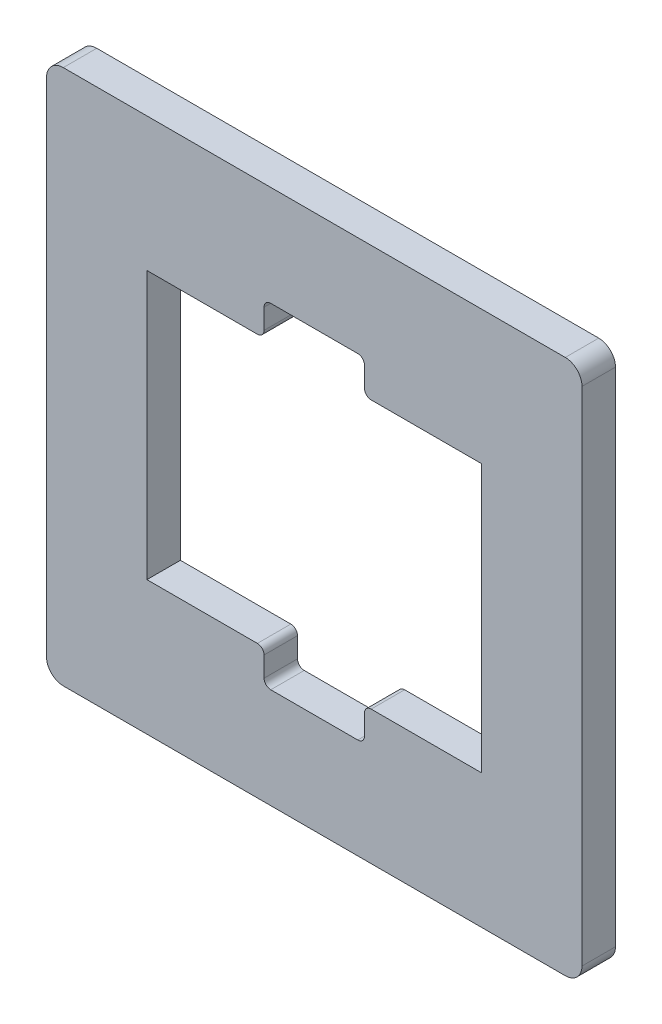
ISO-10303-21;
HEADER;
FILE_DESCRIPTION(('STEP AP214'),'2;1');
FILE_NAME('part.step','',(''),(''),'','','');
FILE_SCHEMA(('AUTOMOTIVE_DESIGN { 1 0 10303 214 1 1 1 1 }'));
ENDSEC;
DATA;
#1=APPLICATION_CONTEXT('core data for automotive mechanical design processes');
#2=APPLICATION_PROTOCOL_DEFINITION('international standard','automotive_design',2000,#1);
#3=PRODUCT_CONTEXT('',#1,'mechanical');
#4=PRODUCT('Part','Part','',(#3));
#5=PRODUCT_RELATED_PRODUCT_CATEGORY('part','',(#4));
#6=PRODUCT_DEFINITION_FORMATION('','',#4);
#7=PRODUCT_DEFINITION_CONTEXT('part definition',#1,'design');
#8=PRODUCT_DEFINITION('design','',#6,#7);
#9=PRODUCT_DEFINITION_SHAPE('','',#8);
#10=(LENGTH_UNIT() NAMED_UNIT(*) SI_UNIT(.MILLI.,.METRE.));
#11=(NAMED_UNIT(*) PLANE_ANGLE_UNIT() SI_UNIT($,.RADIAN.));
#12=(NAMED_UNIT(*) SI_UNIT($,.STERADIAN.) SOLID_ANGLE_UNIT());
#13=UNCERTAINTY_MEASURE_WITH_UNIT(LENGTH_MEASURE(1.E-05),#10,'distance_accuracy_value','');
#14=(GEOMETRIC_REPRESENTATION_CONTEXT(3) GLOBAL_UNCERTAINTY_ASSIGNED_CONTEXT((#13)) GLOBAL_UNIT_ASSIGNED_CONTEXT((#10,
#11,#12)) REPRESENTATION_CONTEXT('',''));
#15=CARTESIAN_POINT('',(0.,0.,0.));
#16=DIRECTION('',(0.,0.,1.));
#17=DIRECTION('',(1.,0.,0.));
#18=AXIS2_PLACEMENT_3D('',#15,#16,#17);
#19=CARTESIAN_POINT('',(0.,0.,-1.));
#20=DIRECTION('',(0.,0.,1.));
#21=DIRECTION('',(1.,0.,0.));
#22=AXIS2_PLACEMENT_3D('',#19,#20,#21);
#23=PLANE('',#22);
#24=DIRECTION('',(1.,0.,0.));
#25=VECTOR('',#24,1.);
#26=CARTESIAN_POINT('',(-8.,-8.,-1.));
#27=LINE('',#26,#25);
#28=CARTESIAN_POINT('',(-7.5,-8.,-1.));
#29=VERTEX_POINT('',#28);
#30=CARTESIAN_POINT('',(7.5,-8.,-1.));
#31=VERTEX_POINT('',#30);
#32=EDGE_CURVE('E284',#29,#31,#27,.T.);
#33=ORIENTED_EDGE('',*,*,#32,.F.);
#34=CARTESIAN_POINT('',(-7.5,-7.5,-1.));
#35=DIRECTION('',(0.,0.,1.));
#36=DIRECTION('',(1.,0.,0.));
#37=AXIS2_PLACEMENT_3D('',#34,#35,#36);
#38=CIRCLE('',#37,0.5);
#39=CARTESIAN_POINT('',(-8.,-7.5,-1.));
#40=VERTEX_POINT('',#39);
#41=EDGE_CURVE('E321',#29,#40,#38,.F.);
#42=ORIENTED_EDGE('',*,*,#41,.T.);
#43=DIRECTION('',(0.,-1.,0.));
#44=VECTOR('',#43,1.);
#45=CARTESIAN_POINT('',(-8.,8.,-1.));
#46=LINE('',#45,#44);
#47=CARTESIAN_POINT('',(-8.,7.5,-1.));
#48=VERTEX_POINT('',#47);
#49=EDGE_CURVE('E281',#48,#40,#46,.T.);
#50=ORIENTED_EDGE('',*,*,#49,.F.);
#51=CARTESIAN_POINT('',(-7.5,7.5,-1.));
#52=DIRECTION('',(0.,0.,1.));
#53=DIRECTION('',(1.,0.,0.));
#54=AXIS2_PLACEMENT_3D('',#51,#52,#53);
#55=CIRCLE('',#54,0.5);
#56=CARTESIAN_POINT('',(-7.5,8.,-1.));
#57=VERTEX_POINT('',#56);
#58=EDGE_CURVE('E315',#48,#57,#55,.F.);
#59=ORIENTED_EDGE('',*,*,#58,.T.);
#60=DIRECTION('',(-1.,0.,0.));
#61=VECTOR('',#60,1.);
#62=CARTESIAN_POINT('',(-8.,8.,-1.));
#63=LINE('',#62,#61);
#64=CARTESIAN_POINT('',(7.5,8.,-1.));
#65=VERTEX_POINT('',#64);
#66=EDGE_CURVE('E277',#65,#57,#63,.T.);
#67=ORIENTED_EDGE('',*,*,#66,.F.);
#68=CARTESIAN_POINT('',(7.5,7.5,-1.));
#69=DIRECTION('',(0.,0.,1.));
#70=DIRECTION('',(1.,0.,0.));
#71=AXIS2_PLACEMENT_3D('',#68,#69,#70);
#72=CIRCLE('',#71,0.5);
#73=CARTESIAN_POINT('',(8.,7.5,-1.));
#74=VERTEX_POINT('',#73);
#75=EDGE_CURVE('E317',#65,#74,#72,.F.);
#76=ORIENTED_EDGE('',*,*,#75,.T.);
#77=DIRECTION('',(0.,1.,0.));
#78=VECTOR('',#77,1.);
#79=CARTESIAN_POINT('',(8.,8.,-1.));
#80=LINE('',#79,#78);
#81=CARTESIAN_POINT('',(8.,-7.5,-1.));
#82=VERTEX_POINT('',#81);
#83=EDGE_CURVE('E274',#82,#74,#80,.T.);
#84=ORIENTED_EDGE('',*,*,#83,.F.);
#85=CARTESIAN_POINT('',(7.5,-7.5,-1.));
#86=DIRECTION('',(0.,0.,1.));
#87=DIRECTION('',(1.,0.,0.));
#88=AXIS2_PLACEMENT_3D('',#85,#86,#87);
#89=CIRCLE('',#88,0.5);
#90=EDGE_CURVE('E319',#82,#31,#89,.F.);
#91=ORIENTED_EDGE('',*,*,#90,.T.);
#92=EDGE_LOOP('',(#33,#42,#50,#59,#67,#76,#84,#91));
#93=FACE_BOUND('',#92,.T.);
#94=DIRECTION('',(0.,-1.,0.));
#95=VECTOR('',#94,1.);
#96=CARTESIAN_POINT('',(1.5,-5.,-1.));
#97=LINE('',#96,#95);
#98=CARTESIAN_POINT('',(1.5,-4.2,-1.));
#99=VERTEX_POINT('',#98);
#100=CARTESIAN_POINT('',(1.5,-4.8,-1.));
#101=VERTEX_POINT('',#100);
#102=EDGE_CURVE('E437',#99,#101,#97,.T.);
#103=ORIENTED_EDGE('',*,*,#102,.F.);
#104=CARTESIAN_POINT('',(1.7,-4.2,-1.));
#105=DIRECTION('',(0.,0.,1.));
#106=DIRECTION('',(1.,0.,0.));
#107=AXIS2_PLACEMENT_3D('',#104,#105,#106);
#108=CIRCLE('',#107,0.2);
#109=CARTESIAN_POINT('',(1.7,-4.,-1.));
#110=VERTEX_POINT('',#109);
#111=EDGE_CURVE('E355',#99,#110,#108,.F.);
#112=ORIENTED_EDGE('',*,*,#111,.T.);
#113=DIRECTION('',(1.,0.,0.));
#114=VECTOR('',#113,1.);
#115=CARTESIAN_POINT('',(-5.,-4.,-1.));
#116=LINE('',#115,#114);
#117=CARTESIAN_POINT('',(5.,-4.,-1.));
#118=VERTEX_POINT('',#117);
#119=EDGE_CURVE('E244',#110,#118,#116,.T.);
#120=ORIENTED_EDGE('',*,*,#119,.T.);
#121=DIRECTION('',(0.,1.,0.));
#122=VECTOR('',#121,1.);
#123=CARTESIAN_POINT('',(5.,4.,-1.));
#124=LINE('',#123,#122);
#125=CARTESIAN_POINT('',(5.,4.,-1.));
#126=VERTEX_POINT('',#125);
#127=EDGE_CURVE('E224',#118,#126,#124,.T.);
#128=ORIENTED_EDGE('',*,*,#127,.T.);
#129=DIRECTION('',(-1.,0.,0.));
#130=VECTOR('',#129,1.);
#131=CARTESIAN_POINT('',(-5.,4.,-1.));
#132=LINE('',#131,#130);
#133=CARTESIAN_POINT('',(1.7,4.,-1.));
#134=VERTEX_POINT('',#133);
#135=EDGE_CURVE('E234',#126,#134,#132,.T.);
#136=ORIENTED_EDGE('',*,*,#135,.T.);
#137=CARTESIAN_POINT('',(1.7,4.2,-1.));
#138=DIRECTION('',(0.,0.,1.));
#139=DIRECTION('',(1.,0.,0.));
#140=AXIS2_PLACEMENT_3D('',#137,#138,#139);
#141=CIRCLE('',#140,0.2);
#142=CARTESIAN_POINT('',(1.5,4.2,-1.));
#143=VERTEX_POINT('',#142);
#144=EDGE_CURVE('E351',#134,#143,#141,.F.);
#145=ORIENTED_EDGE('',*,*,#144,.T.);
#146=DIRECTION('',(0.,1.,0.));
#147=VECTOR('',#146,1.);
#148=CARTESIAN_POINT('',(1.5,5.,-1.));
#149=LINE('',#148,#147);
#150=CARTESIAN_POINT('',(1.5,4.8,-1.));
#151=VERTEX_POINT('',#150);
#152=EDGE_CURVE('E424',#143,#151,#149,.T.);
#153=ORIENTED_EDGE('',*,*,#152,.T.);
#154=CARTESIAN_POINT('',(1.3,4.8,-1.));
#155=DIRECTION('',(0.,0.,1.));
#156=DIRECTION('',(1.,0.,0.));
#157=AXIS2_PLACEMENT_3D('',#154,#155,#156);
#158=CIRCLE('',#157,0.2);
#159=CARTESIAN_POINT('',(1.3,5.,-1.));
#160=VERTEX_POINT('',#159);
#161=EDGE_CURVE('E396',#151,#160,#158,.T.);
#162=ORIENTED_EDGE('',*,*,#161,.T.);
#163=DIRECTION('',(-1.,0.,0.));
#164=VECTOR('',#163,1.);
#165=CARTESIAN_POINT('',(-1.5,5.,-1.));
#166=LINE('',#165,#164);
#167=CARTESIAN_POINT('',(-1.3,5.,-1.));
#168=VERTEX_POINT('',#167);
#169=EDGE_CURVE('E419',#160,#168,#166,.T.);
#170=ORIENTED_EDGE('',*,*,#169,.T.);
#171=CARTESIAN_POINT('',(-1.3,4.8,-1.));
#172=DIRECTION('',(0.,0.,1.));
#173=DIRECTION('',(1.,0.,0.));
#174=AXIS2_PLACEMENT_3D('',#171,#172,#173);
#175=CIRCLE('',#174,0.2);
#176=CARTESIAN_POINT('',(-1.5,4.8,-1.));
#177=VERTEX_POINT('',#176);
#178=EDGE_CURVE('E11',#168,#177,#175,.T.);
#179=ORIENTED_EDGE('',*,*,#178,.T.);
#180=DIRECTION('',(0.,-1.,0.));
#181=VECTOR('',#180,1.);
#182=CARTESIAN_POINT('',(-1.5,5.,-1.));
#183=LINE('',#182,#181);
#184=CARTESIAN_POINT('',(-1.5,4.2,-1.));
#185=VERTEX_POINT('',#184);
#186=EDGE_CURVE('E261',#177,#185,#183,.T.);
#187=ORIENTED_EDGE('',*,*,#186,.T.);
#188=CARTESIAN_POINT('',(-1.7,4.2,-1.));
#189=DIRECTION('',(0.,0.,1.));
#190=DIRECTION('',(1.,0.,0.));
#191=AXIS2_PLACEMENT_3D('',#188,#189,#190);
#192=CIRCLE('',#191,0.2);
#193=CARTESIAN_POINT('',(-1.7,4.,-1.));
#194=VERTEX_POINT('',#193);
#195=EDGE_CURVE('E349',#185,#194,#192,.F.);
#196=ORIENTED_EDGE('',*,*,#195,.T.);
#197=CARTESIAN_POINT('',(-5.,4.,-1.));
#198=VERTEX_POINT('',#197);
#199=EDGE_CURVE('E240',#194,#198,#132,.T.);
#200=ORIENTED_EDGE('',*,*,#199,.T.);
#201=DIRECTION('',(0.,-1.,0.));
#202=VECTOR('',#201,1.);
#203=CARTESIAN_POINT('',(-5.,4.,-1.));
#204=LINE('',#203,#202);
#205=CARTESIAN_POINT('',(-5.,-4.,-1.));
#206=VERTEX_POINT('',#205);
#207=EDGE_CURVE('E239',#198,#206,#204,.T.);
#208=ORIENTED_EDGE('',*,*,#207,.T.);
#209=CARTESIAN_POINT('',(-1.7,-4.,-1.));
#210=VERTEX_POINT('',#209);
#211=EDGE_CURVE('E231',#206,#210,#116,.T.);
#212=ORIENTED_EDGE('',*,*,#211,.T.);
#213=CARTESIAN_POINT('',(-1.7,-4.2,-1.));
#214=DIRECTION('',(0.,0.,1.));
#215=DIRECTION('',(1.,0.,0.));
#216=AXIS2_PLACEMENT_3D('',#213,#214,#215);
#217=CIRCLE('',#216,0.2);
#218=CARTESIAN_POINT('',(-1.5,-4.2,-1.));
#219=VERTEX_POINT('',#218);
#220=EDGE_CURVE('E353',#210,#219,#217,.F.);
#221=ORIENTED_EDGE('',*,*,#220,.T.);
#222=DIRECTION('',(0.,1.,0.));
#223=VECTOR('',#222,1.);
#224=CARTESIAN_POINT('',(-1.5,-5.,-1.));
#225=LINE('',#224,#223);
#226=CARTESIAN_POINT('',(-1.5,-4.8,-1.));
#227=VERTEX_POINT('',#226);
#228=EDGE_CURVE('E433',#227,#219,#225,.T.);
#229=ORIENTED_EDGE('',*,*,#228,.F.);
#230=CARTESIAN_POINT('',(-1.3,-4.8,-1.));
#231=DIRECTION('',(0.,0.,1.));
#232=DIRECTION('',(1.,0.,0.));
#233=AXIS2_PLACEMENT_3D('',#230,#231,#232);
#234=CIRCLE('',#233,0.2);
#235=CARTESIAN_POINT('',(-1.3,-5.,-1.));
#236=VERTEX_POINT('',#235);
#237=EDGE_CURVE('E48',#227,#236,#234,.T.);
#238=ORIENTED_EDGE('',*,*,#237,.T.);
#239=DIRECTION('',(-1.,0.,0.));
#240=VECTOR('',#239,1.);
#241=CARTESIAN_POINT('',(-1.5,-5.,-1.));
#242=LINE('',#241,#240);
#243=CARTESIAN_POINT('',(1.3,-5.,-1.));
#244=VERTEX_POINT('',#243);
#245=EDGE_CURVE('E429',#244,#236,#242,.T.);
#246=ORIENTED_EDGE('',*,*,#245,.F.);
#247=CARTESIAN_POINT('',(1.3,-4.8,-1.));
#248=DIRECTION('',(0.,0.,1.));
#249=DIRECTION('',(1.,0.,0.));
#250=AXIS2_PLACEMENT_3D('',#247,#248,#249);
#251=CIRCLE('',#250,0.2);
#252=EDGE_CURVE('E389',#244,#101,#251,.T.);
#253=ORIENTED_EDGE('',*,*,#252,.T.);
#254=EDGE_LOOP('',(#103,#112,#120,#128,#136,#145,#153,#162,#170,#179,#187,#196,#200,#208,#212,
#221,#229,#238,#246,#253));
#255=FACE_BOUND('',#254,.T.);
#256=ADVANCED_FACE('F33',(#93,#255),#23,.F.);
#257=CARTESIAN_POINT('',(0.,0.,0.));
#258=DIRECTION('',(0.,0.,1.));
#259=DIRECTION('',(1.,0.,0.));
#260=AXIS2_PLACEMENT_3D('',#257,#258,#259);
#261=PLANE('',#260);
#262=DIRECTION('',(0.,-1.,0.));
#263=VECTOR('',#262,1.);
#264=CARTESIAN_POINT('',(-8.,8.,0.));
#265=LINE('',#264,#263);
#266=CARTESIAN_POINT('',(-8.,7.5,0.));
#267=VERTEX_POINT('',#266);
#268=CARTESIAN_POINT('',(-8.,-7.5,0.));
#269=VERTEX_POINT('',#268);
#270=EDGE_CURVE('E293',#267,#269,#265,.T.);
#271=ORIENTED_EDGE('',*,*,#270,.T.);
#272=CARTESIAN_POINT('',(-7.5,-7.5,0.));
#273=DIRECTION('',(0.,0.,1.));
#274=DIRECTION('',(1.,0.,0.));
#275=AXIS2_PLACEMENT_3D('',#272,#273,#274);
#276=CIRCLE('',#275,0.5);
#277=CARTESIAN_POINT('',(-7.5,-8.,0.));
#278=VERTEX_POINT('',#277);
#279=EDGE_CURVE('E308',#269,#278,#276,.T.);
#280=ORIENTED_EDGE('',*,*,#279,.T.);
#281=DIRECTION('',(1.,0.,0.));
#282=VECTOR('',#281,1.);
#283=CARTESIAN_POINT('',(-8.,-8.,0.));
#284=LINE('',#283,#282);
#285=CARTESIAN_POINT('',(7.5,-8.,0.));
#286=VERTEX_POINT('',#285);
#287=EDGE_CURVE('E278',#278,#286,#284,.T.);
#288=ORIENTED_EDGE('',*,*,#287,.T.);
#289=CARTESIAN_POINT('',(7.5,-7.5,0.));
#290=DIRECTION('',(0.,0.,1.));
#291=DIRECTION('',(1.,0.,0.));
#292=AXIS2_PLACEMENT_3D('',#289,#290,#291);
#293=CIRCLE('',#292,0.5);
#294=CARTESIAN_POINT('',(8.,-7.5,0.));
#295=VERTEX_POINT('',#294);
#296=EDGE_CURVE('E306',#286,#295,#293,.T.);
#297=ORIENTED_EDGE('',*,*,#296,.T.);
#298=DIRECTION('',(0.,1.,0.));
#299=VECTOR('',#298,1.);
#300=CARTESIAN_POINT('',(8.,8.,0.));
#301=LINE('',#300,#299);
#302=CARTESIAN_POINT('',(8.,7.5,0.));
#303=VERTEX_POINT('',#302);
#304=EDGE_CURVE('E269',#295,#303,#301,.T.);
#305=ORIENTED_EDGE('',*,*,#304,.T.);
#306=CARTESIAN_POINT('',(7.5,7.5,0.));
#307=DIRECTION('',(0.,0.,1.));
#308=DIRECTION('',(1.,0.,0.));
#309=AXIS2_PLACEMENT_3D('',#306,#307,#308);
#310=CIRCLE('',#309,0.5);
#311=CARTESIAN_POINT('',(7.5,8.,0.));
#312=VERTEX_POINT('',#311);
#313=EDGE_CURVE('E304',#303,#312,#310,.T.);
#314=ORIENTED_EDGE('',*,*,#313,.T.);
#315=DIRECTION('',(-1.,0.,0.));
#316=VECTOR('',#315,1.);
#317=CARTESIAN_POINT('',(-8.,8.,0.));
#318=LINE('',#317,#316);
#319=CARTESIAN_POINT('',(-7.5,8.,0.));
#320=VERTEX_POINT('',#319);
#321=EDGE_CURVE('E290',#312,#320,#318,.T.);
#322=ORIENTED_EDGE('',*,*,#321,.T.);
#323=CARTESIAN_POINT('',(-7.5,7.5,0.));
#324=DIRECTION('',(0.,0.,1.));
#325=DIRECTION('',(1.,0.,0.));
#326=AXIS2_PLACEMENT_3D('',#323,#324,#325);
#327=CIRCLE('',#326,0.5);
#328=EDGE_CURVE('E302',#320,#267,#327,.T.);
#329=ORIENTED_EDGE('',*,*,#328,.T.);
#330=EDGE_LOOP('',(#271,#280,#288,#297,#305,#314,#322,#329));
#331=FACE_BOUND('',#330,.T.);
#332=DIRECTION('',(1.,0.,0.));
#333=VECTOR('',#332,1.);
#334=CARTESIAN_POINT('',(-5.,-4.,0.));
#335=LINE('',#334,#333);
#336=CARTESIAN_POINT('',(1.7,-4.,0.));
#337=VERTEX_POINT('',#336);
#338=CARTESIAN_POINT('',(5.,-4.,0.));
#339=VERTEX_POINT('',#338);
#340=EDGE_CURVE('E249',#337,#339,#335,.T.);
#341=ORIENTED_EDGE('',*,*,#340,.F.);
#342=CARTESIAN_POINT('',(1.7,-4.2,0.));
#343=DIRECTION('',(0.,0.,1.));
#344=DIRECTION('',(1.,0.,0.));
#345=AXIS2_PLACEMENT_3D('',#342,#343,#344);
#346=CIRCLE('',#345,0.2);
#347=CARTESIAN_POINT('',(1.5,-4.2,0.));
#348=VERTEX_POINT('',#347);
#349=EDGE_CURVE('E342',#337,#348,#346,.T.);
#350=ORIENTED_EDGE('',*,*,#349,.T.);
#351=DIRECTION('',(0.,-1.,0.));
#352=VECTOR('',#351,1.);
#353=CARTESIAN_POINT('',(1.5,-5.,0.));
#354=LINE('',#353,#352);
#355=CARTESIAN_POINT('',(1.5,-4.8,0.));
#356=VERTEX_POINT('',#355);
#357=EDGE_CURVE('E441',#348,#356,#354,.T.);
#358=ORIENTED_EDGE('',*,*,#357,.T.);
#359=CARTESIAN_POINT('',(1.3,-4.8,0.));
#360=DIRECTION('',(0.,0.,1.));
#361=DIRECTION('',(1.,0.,0.));
#362=AXIS2_PLACEMENT_3D('',#359,#360,#361);
#363=CIRCLE('',#362,0.2);
#364=CARTESIAN_POINT('',(1.3,-5.,0.));
#365=VERTEX_POINT('',#364);
#366=EDGE_CURVE('E387',#356,#365,#363,.F.);
#367=ORIENTED_EDGE('',*,*,#366,.T.);
#368=DIRECTION('',(-1.,0.,0.));
#369=VECTOR('',#368,1.);
#370=CARTESIAN_POINT('',(-1.5,-5.,0.));
#371=LINE('',#370,#369);
#372=CARTESIAN_POINT('',(-1.3,-5.,0.));
#373=VERTEX_POINT('',#372);
#374=EDGE_CURVE('E447',#365,#373,#371,.T.);
#375=ORIENTED_EDGE('',*,*,#374,.T.);
#376=CARTESIAN_POINT('',(-1.3,-4.8,0.));
#377=DIRECTION('',(0.,0.,1.));
#378=DIRECTION('',(1.,0.,0.));
#379=AXIS2_PLACEMENT_3D('',#376,#377,#378);
#380=CIRCLE('',#379,0.2);
#381=CARTESIAN_POINT('',(-1.5,-4.8,0.));
#382=VERTEX_POINT('',#381);
#383=EDGE_CURVE('E391',#373,#382,#380,.F.);
#384=ORIENTED_EDGE('',*,*,#383,.T.);
#385=DIRECTION('',(0.,1.,0.));
#386=VECTOR('',#385,1.);
#387=CARTESIAN_POINT('',(-1.5,-5.,0.));
#388=LINE('',#387,#386);
#389=CARTESIAN_POINT('',(-1.5,-4.2,0.));
#390=VERTEX_POINT('',#389);
#391=EDGE_CURVE('E444',#382,#390,#388,.T.);
#392=ORIENTED_EDGE('',*,*,#391,.T.);
#393=CARTESIAN_POINT('',(-1.7,-4.2,0.));
#394=DIRECTION('',(0.,0.,1.));
#395=DIRECTION('',(1.,0.,0.));
#396=AXIS2_PLACEMENT_3D('',#393,#394,#395);
#397=CIRCLE('',#396,0.2);
#398=CARTESIAN_POINT('',(-1.7,-4.,0.));
#399=VERTEX_POINT('',#398);
#400=EDGE_CURVE('E340',#390,#399,#397,.T.);
#401=ORIENTED_EDGE('',*,*,#400,.T.);
#402=CARTESIAN_POINT('',(-5.,-4.,0.));
#403=VERTEX_POINT('',#402);
#404=EDGE_CURVE('E246',#403,#399,#335,.T.);
#405=ORIENTED_EDGE('',*,*,#404,.F.);
#406=DIRECTION('',(0.,-1.,0.));
#407=VECTOR('',#406,1.);
#408=CARTESIAN_POINT('',(-5.,4.,0.));
#409=LINE('',#408,#407);
#410=CARTESIAN_POINT('',(-5.,4.,0.));
#411=VERTEX_POINT('',#410);
#412=EDGE_CURVE('E264',#411,#403,#409,.T.);
#413=ORIENTED_EDGE('',*,*,#412,.F.);
#414=DIRECTION('',(-1.,0.,0.));
#415=VECTOR('',#414,1.);
#416=CARTESIAN_POINT('',(-5.,4.,0.));
#417=LINE('',#416,#415);
#418=CARTESIAN_POINT('',(-1.7,4.,0.));
#419=VERTEX_POINT('',#418);
#420=EDGE_CURVE('E260',#419,#411,#417,.T.);
#421=ORIENTED_EDGE('',*,*,#420,.F.);
#422=CARTESIAN_POINT('',(-1.7,4.2,0.));
#423=DIRECTION('',(0.,0.,1.));
#424=DIRECTION('',(1.,0.,0.));
#425=AXIS2_PLACEMENT_3D('',#422,#423,#424);
#426=CIRCLE('',#425,0.2);
#427=CARTESIAN_POINT('',(-1.5,4.2,0.));
#428=VERTEX_POINT('',#427);
#429=EDGE_CURVE('E336',#419,#428,#426,.T.);
#430=ORIENTED_EDGE('',*,*,#429,.T.);
#431=DIRECTION('',(0.,-1.,0.));
#432=VECTOR('',#431,1.);
#433=CARTESIAN_POINT('',(-1.5,5.,0.));
#434=LINE('',#433,#432);
#435=CARTESIAN_POINT('',(-1.5,4.8,0.));
#436=VERTEX_POINT('',#435);
#437=EDGE_CURVE('E252',#436,#428,#434,.T.);
#438=ORIENTED_EDGE('',*,*,#437,.F.);
#439=CARTESIAN_POINT('',(-1.3,4.8,0.));
#440=DIRECTION('',(0.,0.,1.));
#441=DIRECTION('',(1.,0.,0.));
#442=AXIS2_PLACEMENT_3D('',#439,#440,#441);
#443=CIRCLE('',#442,0.2);
#444=CARTESIAN_POINT('',(-1.3,5.,0.));
#445=VERTEX_POINT('',#444);
#446=EDGE_CURVE('E41',#436,#445,#443,.F.);
#447=ORIENTED_EDGE('',*,*,#446,.T.);
#448=DIRECTION('',(-1.,0.,0.));
#449=VECTOR('',#448,1.);
#450=CARTESIAN_POINT('',(-1.5,5.,0.));
#451=LINE('',#450,#449);
#452=CARTESIAN_POINT('',(1.3,5.,0.));
#453=VERTEX_POINT('',#452);
#454=EDGE_CURVE('E403',#453,#445,#451,.T.);
#455=ORIENTED_EDGE('',*,*,#454,.F.);
#456=CARTESIAN_POINT('',(1.3,4.8,0.));
#457=DIRECTION('',(0.,0.,1.));
#458=DIRECTION('',(1.,0.,0.));
#459=AXIS2_PLACEMENT_3D('',#456,#457,#458);
#460=CIRCLE('',#459,0.2);
#461=CARTESIAN_POINT('',(1.5,4.8,0.));
#462=VERTEX_POINT('',#461);
#463=EDGE_CURVE('E394',#453,#462,#460,.F.);
#464=ORIENTED_EDGE('',*,*,#463,.T.);
#465=DIRECTION('',(0.,1.,0.));
#466=VECTOR('',#465,1.);
#467=CARTESIAN_POINT('',(1.5,5.,0.));
#468=LINE('',#467,#466);
#469=CARTESIAN_POINT('',(1.5,4.2,0.));
#470=VERTEX_POINT('',#469);
#471=EDGE_CURVE('E413',#470,#462,#468,.T.);
#472=ORIENTED_EDGE('',*,*,#471,.F.);
#473=CARTESIAN_POINT('',(1.7,4.2,0.));
#474=DIRECTION('',(0.,0.,1.));
#475=DIRECTION('',(1.,0.,0.));
#476=AXIS2_PLACEMENT_3D('',#473,#474,#475);
#477=CIRCLE('',#476,0.2);
#478=CARTESIAN_POINT('',(1.7,4.,0.));
#479=VERTEX_POINT('',#478);
#480=EDGE_CURVE('E338',#470,#479,#477,.T.);
#481=ORIENTED_EDGE('',*,*,#480,.T.);
#482=CARTESIAN_POINT('',(5.,4.,0.));
#483=VERTEX_POINT('',#482);
#484=EDGE_CURVE('E262',#483,#479,#417,.T.);
#485=ORIENTED_EDGE('',*,*,#484,.F.);
#486=DIRECTION('',(0.,1.,0.));
#487=VECTOR('',#486,1.);
#488=CARTESIAN_POINT('',(5.,4.,0.));
#489=LINE('',#488,#487);
#490=EDGE_CURVE('E226',#339,#483,#489,.T.);
#491=ORIENTED_EDGE('',*,*,#490,.F.);
#492=EDGE_LOOP('',(#341,#350,#358,#367,#375,#384,#392,#401,#405,#413,#421,#430,#438,#447,#455,
#464,#472,#481,#485,#491));
#493=FACE_BOUND('',#492,.T.);
#494=ADVANCED_FACE('F402',(#331,#493),#261,.T.);
#495=CARTESIAN_POINT('',(-5.,-4.,-1.));
#496=DIRECTION('',(0.,-1.,0.));
#497=DIRECTION('',(0.,0.,-1.));
#498=AXIS2_PLACEMENT_3D('',#495,#496,#497);
#499=PLANE('',#498);
#500=ORIENTED_EDGE('',*,*,#119,.F.);
#501=DIRECTION('',(0.,0.,1.));
#502=VECTOR('',#501,1.);
#503=CARTESIAN_POINT('',(1.7,-4.,0.));
#504=LINE('',#503,#502);
#505=EDGE_CURVE('E333',#110,#337,#504,.T.);
#506=ORIENTED_EDGE('',*,*,#505,.T.);
#507=ORIENTED_EDGE('',*,*,#340,.T.);
#508=DIRECTION('',(0.,0.,1.));
#509=VECTOR('',#508,1.);
#510=CARTESIAN_POINT('',(5.,-4.,-1.));
#511=LINE('',#510,#509);
#512=EDGE_CURVE('E267',#118,#339,#511,.T.);
#513=ORIENTED_EDGE('',*,*,#512,.F.);
#514=EDGE_LOOP('',(#500,#506,#507,#513));
#515=FACE_BOUND('',#514,.T.);
#516=ADVANCED_FACE('F493',(#515),#499,.F.);
#517=ORIENTED_EDGE('',*,*,#404,.T.);
#518=DIRECTION('',(0.,0.,1.));
#519=VECTOR('',#518,1.);
#520=CARTESIAN_POINT('',(-1.7,-4.,-1.));
#521=LINE('',#520,#519);
#522=EDGE_CURVE('E366',#399,#210,#521,.F.);
#523=ORIENTED_EDGE('',*,*,#522,.T.);
#524=ORIENTED_EDGE('',*,*,#211,.F.);
#525=DIRECTION('',(0.,0.,1.));
#526=VECTOR('',#525,1.);
#527=CARTESIAN_POINT('',(-5.,-4.,-1.));
#528=LINE('',#527,#526);
#529=EDGE_CURVE('E270',#206,#403,#528,.T.);
#530=ORIENTED_EDGE('',*,*,#529,.T.);
#531=EDGE_LOOP('',(#517,#523,#524,#530));
#532=FACE_BOUND('',#531,.T.);
#533=ADVANCED_FACE('F466',(#532),#499,.F.);
#534=CARTESIAN_POINT('',(-5.,4.,-1.));
#535=DIRECTION('',(0.,1.,0.));
#536=DIRECTION('',(0.,0.,1.));
#537=AXIS2_PLACEMENT_3D('',#534,#535,#536);
#538=PLANE('',#537);
#539=ORIENTED_EDGE('',*,*,#484,.T.);
#540=DIRECTION('',(0.,0.,1.));
#541=VECTOR('',#540,1.);
#542=CARTESIAN_POINT('',(1.7,4.,-1.));
#543=LINE('',#542,#541);
#544=EDGE_CURVE('E237',#479,#134,#543,.F.);
#545=ORIENTED_EDGE('',*,*,#544,.T.);
#546=ORIENTED_EDGE('',*,*,#135,.F.);
#547=DIRECTION('',(0.,0.,1.));
#548=VECTOR('',#547,1.);
#549=CARTESIAN_POINT('',(5.,4.,-1.));
#550=LINE('',#549,#548);
#551=EDGE_CURVE('E219',#126,#483,#550,.T.);
#552=ORIENTED_EDGE('',*,*,#551,.T.);
#553=EDGE_LOOP('',(#539,#545,#546,#552));
#554=FACE_BOUND('',#553,.T.);
#555=ADVANCED_FACE('F235',(#554),#538,.F.);
#556=CARTESIAN_POINT('',(8.,8.,-1.));
#557=DIRECTION('',(1.,0.,0.));
#558=DIRECTION('',(0.,1.,0.));
#559=AXIS2_PLACEMENT_3D('',#556,#557,#558);
#560=PLANE('',#559);
#561=ORIENTED_EDGE('',*,*,#304,.F.);
#562=DIRECTION('',(0.,0.,1.));
#563=VECTOR('',#562,1.);
#564=CARTESIAN_POINT('',(8.,-7.5,-1.));
#565=LINE('',#564,#563);
#566=EDGE_CURVE('E326',#295,#82,#565,.F.);
#567=ORIENTED_EDGE('',*,*,#566,.T.);
#568=ORIENTED_EDGE('',*,*,#83,.T.);
#569=DIRECTION('',(0.,0.,1.));
#570=VECTOR('',#569,1.);
#571=CARTESIAN_POINT('',(8.,7.5,-1.));
#572=LINE('',#571,#570);
#573=EDGE_CURVE('E323',#74,#303,#572,.T.);
#574=ORIENTED_EDGE('',*,*,#573,.T.);
#575=EDGE_LOOP('',(#561,#567,#568,#574));
#576=FACE_BOUND('',#575,.T.);
#577=ADVANCED_FACE('F523',(#576),#560,.T.);
#578=CARTESIAN_POINT('',(-8.,-8.,-1.));
#579=DIRECTION('',(0.,-1.,0.));
#580=DIRECTION('',(0.,0.,-1.));
#581=AXIS2_PLACEMENT_3D('',#578,#579,#580);
#582=PLANE('',#581);
#583=ORIENTED_EDGE('',*,*,#287,.F.);
#584=DIRECTION('',(0.,0.,1.));
#585=VECTOR('',#584,1.);
#586=CARTESIAN_POINT('',(-7.5,-8.,-1.));
#587=LINE('',#586,#585);
#588=EDGE_CURVE('E313',#278,#29,#587,.F.);
#589=ORIENTED_EDGE('',*,*,#588,.T.);
#590=ORIENTED_EDGE('',*,*,#32,.T.);
#591=DIRECTION('',(0.,0.,1.));
#592=VECTOR('',#591,1.);
#593=CARTESIAN_POINT('',(7.5,-8.,-1.));
#594=LINE('',#593,#592);
#595=EDGE_CURVE('E310',#31,#286,#594,.T.);
#596=ORIENTED_EDGE('',*,*,#595,.T.);
#597=EDGE_LOOP('',(#583,#589,#590,#596));
#598=FACE_BOUND('',#597,.T.);
#599=ADVANCED_FACE('F519',(#598),#582,.T.);
#600=CARTESIAN_POINT('',(-8.,8.,-1.));
#601=DIRECTION('',(-1.,0.,0.));
#602=DIRECTION('',(0.,-1.,0.));
#603=AXIS2_PLACEMENT_3D('',#600,#601,#602);
#604=PLANE('',#603);
#605=ORIENTED_EDGE('',*,*,#49,.T.);
#606=DIRECTION('',(0.,0.,1.));
#607=VECTOR('',#606,1.);
#608=CARTESIAN_POINT('',(-8.,-7.5,-1.));
#609=LINE('',#608,#607);
#610=EDGE_CURVE('E299',#40,#269,#609,.T.);
#611=ORIENTED_EDGE('',*,*,#610,.T.);
#612=ORIENTED_EDGE('',*,*,#270,.F.);
#613=DIRECTION('',(0.,0.,1.));
#614=VECTOR('',#613,1.);
#615=CARTESIAN_POINT('',(-8.,7.5,-1.));
#616=LINE('',#615,#614);
#617=EDGE_CURVE('E287',#267,#48,#616,.F.);
#618=ORIENTED_EDGE('',*,*,#617,.T.);
#619=EDGE_LOOP('',(#605,#611,#612,#618));
#620=FACE_BOUND('',#619,.T.);
#621=ADVANCED_FACE('F522',(#620),#604,.T.);
#622=CARTESIAN_POINT('',(-8.,8.,-1.));
#623=DIRECTION('',(0.,1.,0.));
#624=DIRECTION('',(0.,0.,1.));
#625=AXIS2_PLACEMENT_3D('',#622,#623,#624);
#626=PLANE('',#625);
#627=ORIENTED_EDGE('',*,*,#321,.F.);
#628=DIRECTION('',(0.,0.,1.));
#629=VECTOR('',#628,1.);
#630=CARTESIAN_POINT('',(7.5,8.,-1.));
#631=LINE('',#630,#629);
#632=EDGE_CURVE('E331',#312,#65,#631,.F.);
#633=ORIENTED_EDGE('',*,*,#632,.T.);
#634=ORIENTED_EDGE('',*,*,#66,.T.);
#635=DIRECTION('',(0.,0.,1.));
#636=VECTOR('',#635,1.);
#637=CARTESIAN_POINT('',(-7.5,8.,-1.));
#638=LINE('',#637,#636);
#639=EDGE_CURVE('E328',#57,#320,#638,.T.);
#640=ORIENTED_EDGE('',*,*,#639,.T.);
#641=EDGE_LOOP('',(#627,#633,#634,#640));
#642=FACE_BOUND('',#641,.T.);
#643=ADVANCED_FACE('F527',(#642),#626,.T.);
#644=CARTESIAN_POINT('',(5.,4.,-1.));
#645=DIRECTION('',(1.,0.,0.));
#646=DIRECTION('',(0.,0.,-1.));
#647=AXIS2_PLACEMENT_3D('',#644,#645,#646);
#648=PLANE('',#647);
#649=ORIENTED_EDGE('',*,*,#490,.T.);
#650=ORIENTED_EDGE('',*,*,#551,.F.);
#651=ORIENTED_EDGE('',*,*,#127,.F.);
#652=ORIENTED_EDGE('',*,*,#512,.T.);
#653=EDGE_LOOP('',(#649,#650,#651,#652));
#654=FACE_BOUND('',#653,.T.);
#655=ADVANCED_FACE('F221',(#654),#648,.F.);
#656=CARTESIAN_POINT('',(-5.,4.,-1.));
#657=DIRECTION('',(-1.,0.,0.));
#658=DIRECTION('',(0.,0.,1.));
#659=AXIS2_PLACEMENT_3D('',#656,#657,#658);
#660=PLANE('',#659);
#661=ORIENTED_EDGE('',*,*,#412,.T.);
#662=ORIENTED_EDGE('',*,*,#529,.F.);
#663=ORIENTED_EDGE('',*,*,#207,.F.);
#664=DIRECTION('',(0.,0.,1.));
#665=VECTOR('',#664,1.);
#666=CARTESIAN_POINT('',(-5.,4.,-1.));
#667=LINE('',#666,#665);
#668=EDGE_CURVE('E230',#198,#411,#667,.T.);
#669=ORIENTED_EDGE('',*,*,#668,.T.);
#670=EDGE_LOOP('',(#661,#662,#663,#669));
#671=FACE_BOUND('',#670,.T.);
#672=ADVANCED_FACE('F462',(#671),#660,.F.);
#673=ORIENTED_EDGE('',*,*,#199,.F.);
#674=DIRECTION('',(0.,0.,1.));
#675=VECTOR('',#674,1.);
#676=CARTESIAN_POINT('',(-1.7,4.,-1.));
#677=LINE('',#676,#675);
#678=EDGE_CURVE('E384',#194,#419,#677,.T.);
#679=ORIENTED_EDGE('',*,*,#678,.T.);
#680=ORIENTED_EDGE('',*,*,#420,.T.);
#681=ORIENTED_EDGE('',*,*,#668,.F.);
#682=EDGE_LOOP('',(#673,#679,#680,#681));
#683=FACE_BOUND('',#682,.T.);
#684=ADVANCED_FACE('F458',(#683),#538,.F.);
#685=CARTESIAN_POINT('',(1.5,5.,-1.));
#686=DIRECTION('',(1.,0.,0.));
#687=DIRECTION('',(0.,1.,0.));
#688=AXIS2_PLACEMENT_3D('',#685,#686,#687);
#689=PLANE('',#688);
#690=ORIENTED_EDGE('',*,*,#152,.F.);
#691=DIRECTION('',(0.,0.,1.));
#692=VECTOR('',#691,1.);
#693=CARTESIAN_POINT('',(1.5,4.2,-1.));
#694=LINE('',#693,#692);
#695=EDGE_CURVE('E370',#143,#470,#694,.T.);
#696=ORIENTED_EDGE('',*,*,#695,.T.);
#697=ORIENTED_EDGE('',*,*,#471,.T.);
#698=DIRECTION('',(0.,0.,1.));
#699=VECTOR('',#698,1.);
#700=CARTESIAN_POINT('',(1.5,4.8,-1.));
#701=LINE('',#700,#699);
#702=EDGE_CURVE('E368',#462,#151,#701,.F.);
#703=ORIENTED_EDGE('',*,*,#702,.T.);
#704=EDGE_LOOP('',(#690,#696,#697,#703));
#705=FACE_BOUND('',#704,.T.);
#706=ADVANCED_FACE('F497',(#705),#689,.F.);
#707=CARTESIAN_POINT('',(-1.5,5.,-1.));
#708=DIRECTION('',(-1.,0.,0.));
#709=DIRECTION('',(0.,0.,1.));
#710=AXIS2_PLACEMENT_3D('',#707,#708,#709);
#711=PLANE('',#710);
#712=ORIENTED_EDGE('',*,*,#186,.F.);
#713=DIRECTION('',(0.,0.,1.));
#714=VECTOR('',#713,1.);
#715=CARTESIAN_POINT('',(-1.5,4.8,0.));
#716=LINE('',#715,#714);
#717=EDGE_CURVE('E381',#177,#436,#716,.T.);
#718=ORIENTED_EDGE('',*,*,#717,.T.);
#719=ORIENTED_EDGE('',*,*,#437,.T.);
#720=DIRECTION('',(0.,0.,1.));
#721=VECTOR('',#720,1.);
#722=CARTESIAN_POINT('',(-1.5,4.2,-1.));
#723=LINE('',#722,#721);
#724=EDGE_CURVE('E379',#428,#185,#723,.F.);
#725=ORIENTED_EDGE('',*,*,#724,.T.);
#726=EDGE_LOOP('',(#712,#718,#719,#725));
#727=FACE_BOUND('',#726,.T.);
#728=ADVANCED_FACE('F421',(#727),#711,.F.);
#729=CARTESIAN_POINT('',(-1.5,5.,-1.));
#730=DIRECTION('',(0.,1.,0.));
#731=DIRECTION('',(0.,0.,1.));
#732=AXIS2_PLACEMENT_3D('',#729,#730,#731);
#733=PLANE('',#732);
#734=ORIENTED_EDGE('',*,*,#169,.F.);
#735=DIRECTION('',(0.,0.,1.));
#736=VECTOR('',#735,1.);
#737=CARTESIAN_POINT('',(1.3,5.,0.));
#738=LINE('',#737,#736);
#739=EDGE_CURVE('E376',#160,#453,#738,.T.);
#740=ORIENTED_EDGE('',*,*,#739,.T.);
#741=ORIENTED_EDGE('',*,*,#454,.T.);
#742=DIRECTION('',(0.,0.,1.));
#743=VECTOR('',#742,1.);
#744=CARTESIAN_POINT('',(-1.3,5.,-1.));
#745=LINE('',#744,#743);
#746=EDGE_CURVE('E374',#445,#168,#745,.F.);
#747=ORIENTED_EDGE('',*,*,#746,.T.);
#748=EDGE_LOOP('',(#734,#740,#741,#747));
#749=FACE_BOUND('',#748,.T.);
#750=ADVANCED_FACE('F410',(#749),#733,.F.);
#751=CARTESIAN_POINT('',(1.5,-5.,-1.));
#752=DIRECTION('',(-1.,0.,0.));
#753=DIRECTION('',(0.,-1.,0.));
#754=AXIS2_PLACEMENT_3D('',#751,#752,#753);
#755=PLANE('',#754);
#756=ORIENTED_EDGE('',*,*,#357,.F.);
#757=DIRECTION('',(0.,0.,1.));
#758=VECTOR('',#757,1.);
#759=CARTESIAN_POINT('',(1.5,-4.2,-1.));
#760=LINE('',#759,#758);
#761=EDGE_CURVE('E347',#348,#99,#760,.F.);
#762=ORIENTED_EDGE('',*,*,#761,.T.);
#763=ORIENTED_EDGE('',*,*,#102,.T.);
#764=DIRECTION('',(0.,0.,1.));
#765=VECTOR('',#764,1.);
#766=CARTESIAN_POINT('',(1.5,-4.8,0.));
#767=LINE('',#766,#765);
#768=EDGE_CURVE('E344',#101,#356,#767,.T.);
#769=ORIENTED_EDGE('',*,*,#768,.T.);
#770=EDGE_LOOP('',(#756,#762,#763,#769));
#771=FACE_BOUND('',#770,.T.);
#772=ADVANCED_FACE('F486',(#771),#755,.T.);
#773=CARTESIAN_POINT('',(-1.5,-5.,-1.));
#774=DIRECTION('',(0.,1.,0.));
#775=DIRECTION('',(0.,0.,1.));
#776=AXIS2_PLACEMENT_3D('',#773,#774,#775);
#777=PLANE('',#776);
#778=ORIENTED_EDGE('',*,*,#374,.F.);
#779=DIRECTION('',(0.,0.,1.));
#780=VECTOR('',#779,1.);
#781=CARTESIAN_POINT('',(1.3,-5.,-1.));
#782=LINE('',#781,#780);
#783=EDGE_CURVE('E55',#365,#244,#782,.F.);
#784=ORIENTED_EDGE('',*,*,#783,.T.);
#785=ORIENTED_EDGE('',*,*,#245,.T.);
#786=DIRECTION('',(0.,0.,1.));
#787=VECTOR('',#786,1.);
#788=CARTESIAN_POINT('',(-1.3,-5.,0.));
#789=LINE('',#788,#787);
#790=EDGE_CURVE('E357',#236,#373,#789,.T.);
#791=ORIENTED_EDGE('',*,*,#790,.T.);
#792=EDGE_LOOP('',(#778,#784,#785,#791));
#793=FACE_BOUND('',#792,.T.);
#794=ADVANCED_FACE('F478',(#793),#777,.T.);
#795=CARTESIAN_POINT('',(-1.5,-5.,-1.));
#796=DIRECTION('',(1.,0.,0.));
#797=DIRECTION('',(0.,0.,-1.));
#798=AXIS2_PLACEMENT_3D('',#795,#796,#797);
#799=PLANE('',#798);
#800=ORIENTED_EDGE('',*,*,#391,.F.);
#801=DIRECTION('',(0.,0.,1.));
#802=VECTOR('',#801,1.);
#803=CARTESIAN_POINT('',(-1.5,-4.8,-1.));
#804=LINE('',#803,#802);
#805=EDGE_CURVE('E364',#382,#227,#804,.F.);
#806=ORIENTED_EDGE('',*,*,#805,.T.);
#807=ORIENTED_EDGE('',*,*,#228,.T.);
#808=DIRECTION('',(0.,0.,1.));
#809=VECTOR('',#808,1.);
#810=CARTESIAN_POINT('',(-1.5,-4.2,0.));
#811=LINE('',#810,#809);
#812=EDGE_CURVE('E361',#219,#390,#811,.T.);
#813=ORIENTED_EDGE('',*,*,#812,.T.);
#814=EDGE_LOOP('',(#800,#806,#807,#813));
#815=FACE_BOUND('',#814,.T.);
#816=ADVANCED_FACE('F474',(#815),#799,.T.);
#817=CARTESIAN_POINT('',(-7.5,-7.5,-1.));
#818=DIRECTION('',(0.,0.,1.));
#819=DIRECTION('',(1.,0.,0.));
#820=AXIS2_PLACEMENT_3D('',#817,#818,#819);
#821=CYLINDRICAL_SURFACE('',#820,0.5);
#822=ORIENTED_EDGE('',*,*,#41,.F.);
#823=ORIENTED_EDGE('',*,*,#588,.F.);
#824=ORIENTED_EDGE('',*,*,#279,.F.);
#825=ORIENTED_EDGE('',*,*,#610,.F.);
#826=EDGE_LOOP('',(#822,#823,#824,#825));
#827=FACE_BOUND('',#826,.T.);
#828=ADVANCED_FACE('F535',(#827),#821,.T.);
#829=CARTESIAN_POINT('',(7.5,-7.5,-1.));
#830=DIRECTION('',(0.,0.,1.));
#831=DIRECTION('',(1.,0.,0.));
#832=AXIS2_PLACEMENT_3D('',#829,#830,#831);
#833=CYLINDRICAL_SURFACE('',#832,0.5);
#834=ORIENTED_EDGE('',*,*,#90,.F.);
#835=ORIENTED_EDGE('',*,*,#566,.F.);
#836=ORIENTED_EDGE('',*,*,#296,.F.);
#837=ORIENTED_EDGE('',*,*,#595,.F.);
#838=EDGE_LOOP('',(#834,#835,#836,#837));
#839=FACE_BOUND('',#838,.T.);
#840=ADVANCED_FACE('F538',(#839),#833,.T.);
#841=CARTESIAN_POINT('',(7.5,7.5,-1.));
#842=DIRECTION('',(0.,0.,1.));
#843=DIRECTION('',(1.,0.,0.));
#844=AXIS2_PLACEMENT_3D('',#841,#842,#843);
#845=CYLINDRICAL_SURFACE('',#844,0.5);
#846=ORIENTED_EDGE('',*,*,#75,.F.);
#847=ORIENTED_EDGE('',*,*,#632,.F.);
#848=ORIENTED_EDGE('',*,*,#313,.F.);
#849=ORIENTED_EDGE('',*,*,#573,.F.);
#850=EDGE_LOOP('',(#846,#847,#848,#849));
#851=FACE_BOUND('',#850,.T.);
#852=ADVANCED_FACE('F542',(#851),#845,.T.);
#853=CARTESIAN_POINT('',(-7.5,7.5,-1.));
#854=DIRECTION('',(0.,0.,1.));
#855=DIRECTION('',(1.,0.,0.));
#856=AXIS2_PLACEMENT_3D('',#853,#854,#855);
#857=CYLINDRICAL_SURFACE('',#856,0.5);
#858=ORIENTED_EDGE('',*,*,#58,.F.);
#859=ORIENTED_EDGE('',*,*,#617,.F.);
#860=ORIENTED_EDGE('',*,*,#328,.F.);
#861=ORIENTED_EDGE('',*,*,#639,.F.);
#862=EDGE_LOOP('',(#858,#859,#860,#861));
#863=FACE_BOUND('',#862,.T.);
#864=ADVANCED_FACE('F546',(#863),#857,.T.);
#865=CARTESIAN_POINT('',(1.7,-4.2,-1.));
#866=DIRECTION('',(0.,0.,-1.));
#867=DIRECTION('',(-1.,0.,0.));
#868=AXIS2_PLACEMENT_3D('',#865,#866,#867);
#869=CYLINDRICAL_SURFACE('',#868,0.2);
#870=ORIENTED_EDGE('',*,*,#111,.F.);
#871=ORIENTED_EDGE('',*,*,#761,.F.);
#872=ORIENTED_EDGE('',*,*,#349,.F.);
#873=ORIENTED_EDGE('',*,*,#505,.F.);
#874=EDGE_LOOP('',(#870,#871,#872,#873));
#875=FACE_BOUND('',#874,.T.);
#876=ADVANCED_FACE('F491',(#875),#869,.T.);
#877=CARTESIAN_POINT('',(1.3,-4.8,-1.));
#878=DIRECTION('',(0.,0.,-1.));
#879=DIRECTION('',(-1.,0.,0.));
#880=AXIS2_PLACEMENT_3D('',#877,#878,#879);
#881=CYLINDRICAL_SURFACE('',#880,0.2);
#882=ORIENTED_EDGE('',*,*,#252,.F.);
#883=ORIENTED_EDGE('',*,*,#783,.F.);
#884=ORIENTED_EDGE('',*,*,#366,.F.);
#885=ORIENTED_EDGE('',*,*,#768,.F.);
#886=EDGE_LOOP('',(#882,#883,#884,#885));
#887=FACE_BOUND('',#886,.T.);
#888=ADVANCED_FACE('F483',(#887),#881,.F.);
#889=CARTESIAN_POINT('',(-1.3,-4.8,-1.));
#890=DIRECTION('',(0.,0.,-1.));
#891=DIRECTION('',(-1.,0.,0.));
#892=AXIS2_PLACEMENT_3D('',#889,#890,#891);
#893=CYLINDRICAL_SURFACE('',#892,0.2);
#894=ORIENTED_EDGE('',*,*,#237,.F.);
#895=ORIENTED_EDGE('',*,*,#805,.F.);
#896=ORIENTED_EDGE('',*,*,#383,.F.);
#897=ORIENTED_EDGE('',*,*,#790,.F.);
#898=EDGE_LOOP('',(#894,#895,#896,#897));
#899=FACE_BOUND('',#898,.T.);
#900=ADVANCED_FACE('F477',(#899),#893,.F.);
#901=CARTESIAN_POINT('',(-1.7,-4.2,-1.));
#902=DIRECTION('',(0.,0.,-1.));
#903=DIRECTION('',(-1.,0.,0.));
#904=AXIS2_PLACEMENT_3D('',#901,#902,#903);
#905=CYLINDRICAL_SURFACE('',#904,0.2);
#906=ORIENTED_EDGE('',*,*,#220,.F.);
#907=ORIENTED_EDGE('',*,*,#522,.F.);
#908=ORIENTED_EDGE('',*,*,#400,.F.);
#909=ORIENTED_EDGE('',*,*,#812,.F.);
#910=EDGE_LOOP('',(#906,#907,#908,#909));
#911=FACE_BOUND('',#910,.T.);
#912=ADVANCED_FACE('F470',(#911),#905,.T.);
#913=CARTESIAN_POINT('',(1.7,4.2,-1.));
#914=DIRECTION('',(0.,0.,1.));
#915=DIRECTION('',(1.,0.,0.));
#916=AXIS2_PLACEMENT_3D('',#913,#914,#915);
#917=CYLINDRICAL_SURFACE('',#916,0.2);
#918=ORIENTED_EDGE('',*,*,#144,.F.);
#919=ORIENTED_EDGE('',*,*,#544,.F.);
#920=ORIENTED_EDGE('',*,*,#480,.F.);
#921=ORIENTED_EDGE('',*,*,#695,.F.);
#922=EDGE_LOOP('',(#918,#919,#920,#921));
#923=FACE_BOUND('',#922,.T.);
#924=ADVANCED_FACE('F495',(#923),#917,.T.);
#925=CARTESIAN_POINT('',(1.3,4.8,-1.));
#926=DIRECTION('',(0.,0.,-1.));
#927=DIRECTION('',(-1.,0.,0.));
#928=AXIS2_PLACEMENT_3D('',#925,#926,#927);
#929=CYLINDRICAL_SURFACE('',#928,0.2);
#930=ORIENTED_EDGE('',*,*,#161,.F.);
#931=ORIENTED_EDGE('',*,*,#702,.F.);
#932=ORIENTED_EDGE('',*,*,#463,.F.);
#933=ORIENTED_EDGE('',*,*,#739,.F.);
#934=EDGE_LOOP('',(#930,#931,#932,#933));
#935=FACE_BOUND('',#934,.T.);
#936=ADVANCED_FACE('F499',(#935),#929,.F.);
#937=CARTESIAN_POINT('',(-1.3,4.8,-1.));
#938=DIRECTION('',(0.,0.,-1.));
#939=DIRECTION('',(-1.,0.,0.));
#940=AXIS2_PLACEMENT_3D('',#937,#938,#939);
#941=CYLINDRICAL_SURFACE('',#940,0.2);
#942=ORIENTED_EDGE('',*,*,#178,.F.);
#943=ORIENTED_EDGE('',*,*,#746,.F.);
#944=ORIENTED_EDGE('',*,*,#446,.F.);
#945=ORIENTED_EDGE('',*,*,#717,.F.);
#946=EDGE_LOOP('',(#942,#943,#944,#945));
#947=FACE_BOUND('',#946,.T.);
#948=ADVANCED_FACE('F415',(#947),#941,.F.);
#949=CARTESIAN_POINT('',(-1.7,4.2,-1.));
#950=DIRECTION('',(0.,0.,1.));
#951=DIRECTION('',(1.,0.,0.));
#952=AXIS2_PLACEMENT_3D('',#949,#950,#951);
#953=CYLINDRICAL_SURFACE('',#952,0.2);
#954=ORIENTED_EDGE('',*,*,#195,.F.);
#955=ORIENTED_EDGE('',*,*,#724,.F.);
#956=ORIENTED_EDGE('',*,*,#429,.F.);
#957=ORIENTED_EDGE('',*,*,#678,.F.);
#958=EDGE_LOOP('',(#954,#955,#956,#957));
#959=FACE_BOUND('',#958,.T.);
#960=ADVANCED_FACE('F35',(#959),#953,.T.);
#961=CLOSED_SHELL('',(#256,#494,#516,#533,#555,#577,#599,#621,#643,#655,#672,#684,#706,#728,
#750,#772,#794,#816,#828,#840,#852,#864,#876,#888,#900,#912,#924,#936,#948,#960));
#962=MANIFOLD_SOLID_BREP('B2',#961);
#963=ADVANCED_BREP_SHAPE_REPRESENTATION('',(#18,#962),#14);
#964=SHAPE_DEFINITION_REPRESENTATION(#9,#963);
ENDSEC;
END-ISO-10303-21;
